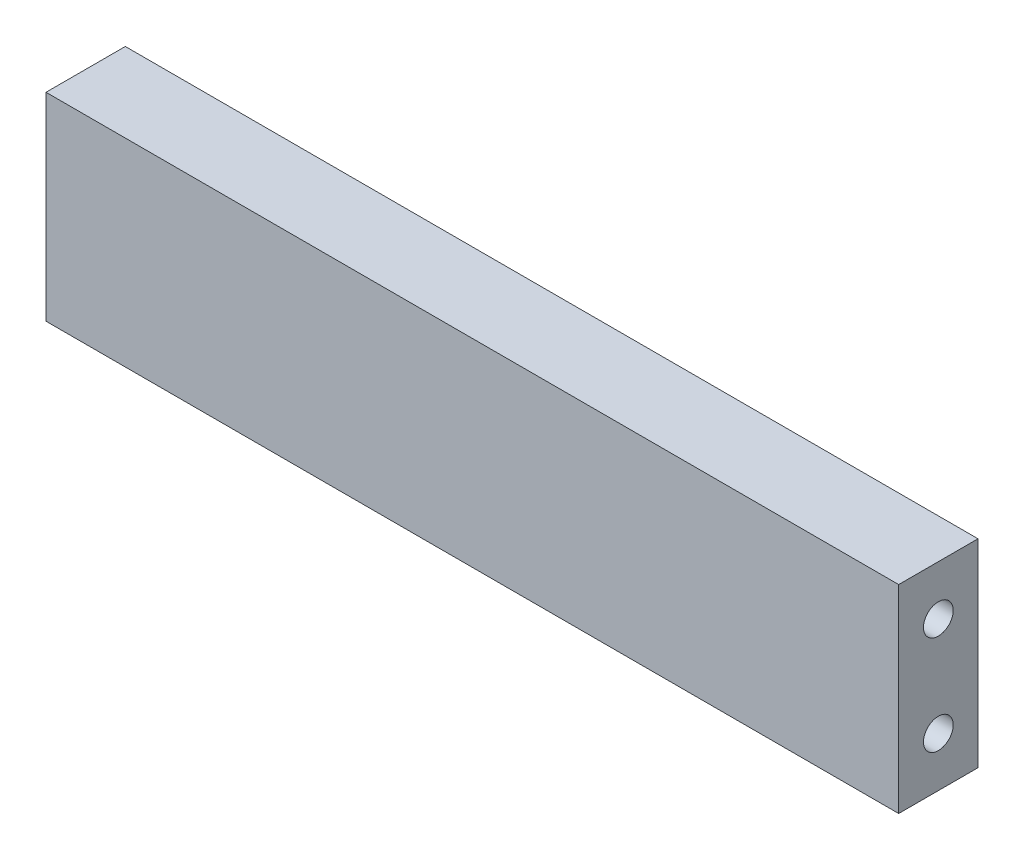
ISO-10303-21;
HEADER;
FILE_DESCRIPTION(('STEP AP214'),'2;1');
FILE_NAME('part.step','',(''),(''),'','','');
FILE_SCHEMA(('AUTOMOTIVE_DESIGN { 1 0 10303 214 1 1 1 1 }'));
ENDSEC;
DATA;
#1=APPLICATION_CONTEXT('core data for automotive mechanical design processes');
#2=APPLICATION_PROTOCOL_DEFINITION('international standard','automotive_design',2000,#1);
#3=PRODUCT_CONTEXT('',#1,'mechanical');
#4=PRODUCT('Part','Part','',(#3));
#5=PRODUCT_RELATED_PRODUCT_CATEGORY('part','',(#4));
#6=PRODUCT_DEFINITION_FORMATION('','',#4);
#7=PRODUCT_DEFINITION_CONTEXT('part definition',#1,'design');
#8=PRODUCT_DEFINITION('design','',#6,#7);
#9=PRODUCT_DEFINITION_SHAPE('','',#8);
#10=(LENGTH_UNIT() NAMED_UNIT(*) SI_UNIT(.MILLI.,.METRE.));
#11=(NAMED_UNIT(*) PLANE_ANGLE_UNIT() SI_UNIT($,.RADIAN.));
#12=(NAMED_UNIT(*) SI_UNIT($,.STERADIAN.) SOLID_ANGLE_UNIT());
#13=UNCERTAINTY_MEASURE_WITH_UNIT(LENGTH_MEASURE(1.E-05),#10,'distance_accuracy_value','');
#14=(GEOMETRIC_REPRESENTATION_CONTEXT(3) GLOBAL_UNCERTAINTY_ASSIGNED_CONTEXT((#13)) GLOBAL_UNIT_ASSIGNED_CONTEXT((#10,
#11,#12)) REPRESENTATION_CONTEXT('',''));
#15=CARTESIAN_POINT('',(0.,0.,0.));
#16=DIRECTION('',(0.,0.,1.));
#17=DIRECTION('',(1.,0.,0.));
#18=AXIS2_PLACEMENT_3D('',#15,#16,#17);
#19=CARTESIAN_POINT('',(-43.,10.,8.));
#20=DIRECTION('',(1.,0.,0.));
#21=DIRECTION('',(0.,0.,-1.));
#22=AXIS2_PLACEMENT_3D('',#19,#20,#21);
#23=PLANE('',#22);
#24=CARTESIAN_POINT('',(-43.,-5.00000000000003,4.));
#25=DIRECTION('',(-1.,0.,0.));
#26=DIRECTION('',(0.,0.,1.));
#27=AXIS2_PLACEMENT_3D('',#24,#25,#26);
#28=CIRCLE('',#27,1.5);
#29=CARTESIAN_POINT('',(-43.,-5.00000000000003,5.5));
#30=VERTEX_POINT('',#29);
#31=EDGE_CURVE('E111',#30,#30,#28,.T.);
#32=ORIENTED_EDGE('',*,*,#31,.F.);
#33=EDGE_LOOP('',(#32));
#34=FACE_BOUND('',#33,.T.);
#35=DIRECTION('',(0.,-1.,0.));
#36=VECTOR('',#35,1.);
#37=CARTESIAN_POINT('',(-43.,10.,0.));
#38=LINE('',#37,#36);
#39=CARTESIAN_POINT('',(-43.,10.,0.));
#40=VERTEX_POINT('',#39);
#41=CARTESIAN_POINT('',(-43.,-10.,0.));
#42=VERTEX_POINT('',#41);
#43=EDGE_CURVE('E116',#40,#42,#38,.T.);
#44=ORIENTED_EDGE('',*,*,#43,.T.);
#45=DIRECTION('',(0.,0.,-1.));
#46=VECTOR('',#45,1.);
#47=CARTESIAN_POINT('',(-43.,-10.,8.));
#48=LINE('',#47,#46);
#49=CARTESIAN_POINT('',(-43.,-10.,8.));
#50=VERTEX_POINT('',#49);
#51=EDGE_CURVE('E11',#50,#42,#48,.T.);
#52=ORIENTED_EDGE('',*,*,#51,.F.);
#53=DIRECTION('',(0.,-1.,0.));
#54=VECTOR('',#53,1.);
#55=CARTESIAN_POINT('',(-43.,10.,8.));
#56=LINE('',#55,#54);
#57=CARTESIAN_POINT('',(-43.,10.,8.));
#58=VERTEX_POINT('',#57);
#59=EDGE_CURVE('E175',#58,#50,#56,.T.);
#60=ORIENTED_EDGE('',*,*,#59,.F.);
#61=DIRECTION('',(0.,0.,-1.));
#62=VECTOR('',#61,1.);
#63=CARTESIAN_POINT('',(-43.,10.,8.));
#64=LINE('',#63,#62);
#65=EDGE_CURVE('E44',#58,#40,#64,.T.);
#66=ORIENTED_EDGE('',*,*,#65,.T.);
#67=EDGE_LOOP('',(#44,#52,#60,#66));
#68=FACE_BOUND('',#67,.T.);
#69=CARTESIAN_POINT('',(-43.,4.99999999999997,4.));
#70=DIRECTION('',(-1.,0.,0.));
#71=DIRECTION('',(0.,0.,1.));
#72=AXIS2_PLACEMENT_3D('',#69,#70,#71);
#73=CIRCLE('',#72,1.5);
#74=CARTESIAN_POINT('',(-43.,4.99999999999997,5.5));
#75=VERTEX_POINT('',#74);
#76=EDGE_CURVE('E120',#75,#75,#73,.T.);
#77=ORIENTED_EDGE('',*,*,#76,.F.);
#78=EDGE_LOOP('',(#77));
#79=FACE_BOUND('',#78,.T.);
#80=ADVANCED_FACE('F30',(#34,#68,#79),#23,.F.);
#81=CARTESIAN_POINT('',(43.,-10.,8.));
#82=DIRECTION('',(-1.,0.,0.));
#83=DIRECTION('',(0.,0.,1.));
#84=AXIS2_PLACEMENT_3D('',#81,#82,#83);
#85=PLANE('',#84);
#86=CARTESIAN_POINT('',(43.,-5.00000000000002,4.));
#87=DIRECTION('',(1.,0.,0.));
#88=DIRECTION('',(0.,0.,-1.));
#89=AXIS2_PLACEMENT_3D('',#86,#87,#88);
#90=CIRCLE('',#89,1.5);
#91=CARTESIAN_POINT('',(43.,-5.00000000000002,2.5));
#92=VERTEX_POINT('',#91);
#93=EDGE_CURVE('E154',#92,#92,#90,.T.);
#94=ORIENTED_EDGE('',*,*,#93,.F.);
#95=EDGE_LOOP('',(#94));
#96=FACE_BOUND('',#95,.T.);
#97=DIRECTION('',(0.,1.,0.));
#98=VECTOR('',#97,1.);
#99=CARTESIAN_POINT('',(43.,-10.,0.));
#100=LINE('',#99,#98);
#101=CARTESIAN_POINT('',(43.,-10.,0.));
#102=VERTEX_POINT('',#101);
#103=CARTESIAN_POINT('',(43.,10.,0.));
#104=VERTEX_POINT('',#103);
#105=EDGE_CURVE('E169',#102,#104,#100,.T.);
#106=ORIENTED_EDGE('',*,*,#105,.T.);
#107=DIRECTION('',(0.,0.,-1.));
#108=VECTOR('',#107,1.);
#109=CARTESIAN_POINT('',(43.,10.,8.));
#110=LINE('',#109,#108);
#111=CARTESIAN_POINT('',(43.,10.,8.));
#112=VERTEX_POINT('',#111);
#113=EDGE_CURVE('E184',#112,#104,#110,.T.);
#114=ORIENTED_EDGE('',*,*,#113,.F.);
#115=DIRECTION('',(0.,1.,0.));
#116=VECTOR('',#115,1.);
#117=CARTESIAN_POINT('',(43.,-10.,8.));
#118=LINE('',#117,#116);
#119=CARTESIAN_POINT('',(43.,-10.,8.));
#120=VERTEX_POINT('',#119);
#121=EDGE_CURVE('E52',#120,#112,#118,.T.);
#122=ORIENTED_EDGE('',*,*,#121,.F.);
#123=DIRECTION('',(0.,0.,-1.));
#124=VECTOR('',#123,1.);
#125=CARTESIAN_POINT('',(43.,-10.,8.));
#126=LINE('',#125,#124);
#127=EDGE_CURVE('E37',#120,#102,#126,.T.);
#128=ORIENTED_EDGE('',*,*,#127,.T.);
#129=EDGE_LOOP('',(#106,#114,#122,#128));
#130=FACE_BOUND('',#129,.T.);
#131=CARTESIAN_POINT('',(43.,4.99999999999998,4.));
#132=DIRECTION('',(1.,0.,0.));
#133=DIRECTION('',(0.,0.,-1.));
#134=AXIS2_PLACEMENT_3D('',#131,#132,#133);
#135=CIRCLE('',#134,1.5);
#136=CARTESIAN_POINT('',(43.,4.99999999999998,2.5));
#137=VERTEX_POINT('',#136);
#138=EDGE_CURVE('E132',#137,#137,#135,.T.);
#139=ORIENTED_EDGE('',*,*,#138,.F.);
#140=EDGE_LOOP('',(#139));
#141=FACE_BOUND('',#140,.T.);
#142=ADVANCED_FACE('F100',(#96,#130,#141),#85,.F.);
#143=CARTESIAN_POINT('',(43.,-10.,8.));
#144=DIRECTION('',(0.,-1.,0.));
#145=DIRECTION('',(1.,0.,0.));
#146=AXIS2_PLACEMENT_3D('',#143,#144,#145);
#147=PLANE('',#146);
#148=DIRECTION('',(-1.,0.,0.));
#149=VECTOR('',#148,1.);
#150=CARTESIAN_POINT('',(43.,-10.,0.));
#151=LINE('',#150,#149);
#152=EDGE_CURVE('E167',#102,#42,#151,.T.);
#153=ORIENTED_EDGE('',*,*,#152,.F.);
#154=ORIENTED_EDGE('',*,*,#127,.F.);
#155=DIRECTION('',(-1.,0.,0.));
#156=VECTOR('',#155,1.);
#157=CARTESIAN_POINT('',(43.,-10.,8.));
#158=LINE('',#157,#156);
#159=EDGE_CURVE('E177',#120,#50,#158,.T.);
#160=ORIENTED_EDGE('',*,*,#159,.T.);
#161=ORIENTED_EDGE('',*,*,#51,.T.);
#162=EDGE_LOOP('',(#153,#154,#160,#161));
#163=FACE_BOUND('',#162,.T.);
#164=ADVANCED_FACE('F105',(#163),#147,.T.);
#165=CARTESIAN_POINT('',(-43.,10.,8.));
#166=DIRECTION('',(0.,1.,0.));
#167=DIRECTION('',(-1.,0.,0.));
#168=AXIS2_PLACEMENT_3D('',#165,#166,#167);
#169=PLANE('',#168);
#170=DIRECTION('',(1.,0.,0.));
#171=VECTOR('',#170,1.);
#172=CARTESIAN_POINT('',(-43.,10.,0.));
#173=LINE('',#172,#171);
#174=EDGE_CURVE('E172',#40,#104,#173,.T.);
#175=ORIENTED_EDGE('',*,*,#174,.F.);
#176=ORIENTED_EDGE('',*,*,#65,.F.);
#177=DIRECTION('',(1.,0.,0.));
#178=VECTOR('',#177,1.);
#179=CARTESIAN_POINT('',(-43.,10.,8.));
#180=LINE('',#179,#178);
#181=EDGE_CURVE('E181',#58,#112,#180,.T.);
#182=ORIENTED_EDGE('',*,*,#181,.T.);
#183=ORIENTED_EDGE('',*,*,#113,.T.);
#184=EDGE_LOOP('',(#175,#176,#182,#183));
#185=FACE_BOUND('',#184,.T.);
#186=ADVANCED_FACE('F193',(#185),#169,.T.);
#187=CARTESIAN_POINT('',(-43.,10.,8.));
#188=DIRECTION('',(0.,0.,1.));
#189=DIRECTION('',(1.,0.,0.));
#190=AXIS2_PLACEMENT_3D('',#187,#188,#189);
#191=PLANE('',#190);
#192=ORIENTED_EDGE('',*,*,#59,.T.);
#193=ORIENTED_EDGE('',*,*,#159,.F.);
#194=ORIENTED_EDGE('',*,*,#121,.T.);
#195=ORIENTED_EDGE('',*,*,#181,.F.);
#196=EDGE_LOOP('',(#192,#193,#194,#195));
#197=FACE_BOUND('',#196,.T.);
#198=ADVANCED_FACE('F192',(#197),#191,.T.);
#199=CARTESIAN_POINT('',(-43.,10.,0.));
#200=DIRECTION('',(0.,0.,1.));
#201=DIRECTION('',(1.,0.,0.));
#202=AXIS2_PLACEMENT_3D('',#199,#200,#201);
#203=PLANE('',#202);
#204=ORIENTED_EDGE('',*,*,#43,.F.);
#205=ORIENTED_EDGE('',*,*,#174,.T.);
#206=ORIENTED_EDGE('',*,*,#105,.F.);
#207=ORIENTED_EDGE('',*,*,#152,.T.);
#208=EDGE_LOOP('',(#204,#205,#206,#207));
#209=FACE_BOUND('',#208,.T.);
#210=ADVANCED_FACE('F191',(#209),#203,.F.);
#211=CARTESIAN_POINT('',(31.5669872981078,-5.00000000000002,4.));
#212=DIRECTION('',(1.,0.,0.));
#213=DIRECTION('',(0.,0.,-1.));
#214=AXIS2_PLACEMENT_3D('',#211,#212,#213);
#215=CONICAL_SURFACE('',#214,0.,1.0471975511966);
#216=CARTESIAN_POINT('',(32.,-5.00000000000002,4.));
#217=DIRECTION('',(1.,0.,0.));
#218=DIRECTION('',(0.,0.,-1.));
#219=AXIS2_PLACEMENT_3D('',#216,#217,#218);
#220=CIRCLE('',#219,0.75);
#221=CARTESIAN_POINT('',(32.,-5.00000000000002,3.25));
#222=VERTEX_POINT('',#221);
#223=EDGE_CURVE('E163',#222,#222,#220,.T.);
#224=ORIENTED_EDGE('',*,*,#223,.T.);
#225=EDGE_LOOP('',(#224));
#226=FACE_BOUND('',#225,.T.);
#227=CARTESIAN_POINT('',(31.5669872981078,-5.00000000000002,4.));
#228=VERTEX_POINT('',#227);
#229=VERTEX_LOOP('',#228);
#230=FACE_BOUND('',#229,.T.);
#231=ADVANCED_FACE('F204',(#226,#230),#215,.F.);
#232=CARTESIAN_POINT('',(43.,-5.00000000000002,4.));
#233=DIRECTION('',(1.,0.,0.));
#234=DIRECTION('',(0.,0.,-1.));
#235=AXIS2_PLACEMENT_3D('',#232,#233,#234);
#236=CYLINDRICAL_SURFACE('',#235,0.75);
#237=CARTESIAN_POINT('',(35.,-5.00000000000002,4.));
#238=DIRECTION('',(1.,0.,0.));
#239=DIRECTION('',(0.,0.,-1.));
#240=AXIS2_PLACEMENT_3D('',#237,#238,#239);
#241=CIRCLE('',#240,0.75);
#242=CARTESIAN_POINT('',(35.,-5.00000000000002,3.25));
#243=VERTEX_POINT('',#242);
#244=EDGE_CURVE('E160',#243,#243,#241,.T.);
#245=ORIENTED_EDGE('',*,*,#244,.T.);
#246=EDGE_LOOP('',(#245));
#247=FACE_BOUND('',#246,.T.);
#248=ORIENTED_EDGE('',*,*,#223,.F.);
#249=EDGE_LOOP('',(#248));
#250=FACE_BOUND('',#249,.T.);
#251=ADVANCED_FACE('F207',(#247,#250),#236,.F.);
#252=CARTESIAN_POINT('',(35.,-4.25000000000003,4.));
#253=DIRECTION('',(1.,0.,0.));
#254=DIRECTION('',(0.,0.,-1.));
#255=AXIS2_PLACEMENT_3D('',#252,#253,#254);
#256=PLANE('',#255);
#257=CARTESIAN_POINT('',(35.,-5.00000000000002,4.));
#258=DIRECTION('',(1.,0.,0.));
#259=DIRECTION('',(0.,0.,-1.));
#260=AXIS2_PLACEMENT_3D('',#257,#258,#259);
#261=CIRCLE('',#260,1.5);
#262=CARTESIAN_POINT('',(35.,-5.00000000000002,2.5));
#263=VERTEX_POINT('',#262);
#264=EDGE_CURVE('E157',#263,#263,#261,.T.);
#265=ORIENTED_EDGE('',*,*,#264,.T.);
#266=EDGE_LOOP('',(#265));
#267=FACE_BOUND('',#266,.T.);
#268=ORIENTED_EDGE('',*,*,#244,.F.);
#269=EDGE_LOOP('',(#268));
#270=FACE_BOUND('',#269,.T.);
#271=ADVANCED_FACE('F211',(#267,#270),#256,.T.);
#272=CARTESIAN_POINT('',(43.,-5.00000000000002,4.));
#273=DIRECTION('',(1.,0.,0.));
#274=DIRECTION('',(0.,0.,-1.));
#275=AXIS2_PLACEMENT_3D('',#272,#273,#274);
#276=CYLINDRICAL_SURFACE('',#275,1.5);
#277=ORIENTED_EDGE('',*,*,#93,.T.);
#278=EDGE_LOOP('',(#277));
#279=FACE_BOUND('',#278,.T.);
#280=ORIENTED_EDGE('',*,*,#264,.F.);
#281=EDGE_LOOP('',(#280));
#282=FACE_BOUND('',#281,.T.);
#283=ADVANCED_FACE('F215',(#279,#282),#276,.F.);
#284=CARTESIAN_POINT('',(-31.5669872981078,-5.00000000000003,4.));
#285=DIRECTION('',(-1.,0.,0.));
#286=DIRECTION('',(0.,0.,1.));
#287=AXIS2_PLACEMENT_3D('',#284,#285,#286);
#288=CONICAL_SURFACE('',#287,0.,1.0471975511966);
#289=CARTESIAN_POINT('',(-32.,-5.00000000000003,4.));
#290=DIRECTION('',(-1.,0.,0.));
#291=DIRECTION('',(0.,0.,1.));
#292=AXIS2_PLACEMENT_3D('',#289,#290,#291);
#293=CIRCLE('',#292,0.75);
#294=CARTESIAN_POINT('',(-32.,-5.00000000000003,4.75));
#295=VERTEX_POINT('',#294);
#296=EDGE_CURVE('E151',#295,#295,#293,.T.);
#297=ORIENTED_EDGE('',*,*,#296,.T.);
#298=EDGE_LOOP('',(#297));
#299=FACE_BOUND('',#298,.T.);
#300=CARTESIAN_POINT('',(-31.5669872981078,-5.00000000000003,4.));
#301=VERTEX_POINT('',#300);
#302=VERTEX_LOOP('',#301);
#303=FACE_BOUND('',#302,.T.);
#304=ADVANCED_FACE('F219',(#299,#303),#288,.F.);
#305=CARTESIAN_POINT('',(-43.,-5.00000000000003,4.));
#306=DIRECTION('',(-1.,0.,0.));
#307=DIRECTION('',(0.,0.,1.));
#308=AXIS2_PLACEMENT_3D('',#305,#306,#307);
#309=CYLINDRICAL_SURFACE('',#308,0.75);
#310=CARTESIAN_POINT('',(-35.,-5.00000000000003,4.));
#311=DIRECTION('',(-1.,0.,0.));
#312=DIRECTION('',(0.,0.,1.));
#313=AXIS2_PLACEMENT_3D('',#310,#311,#312);
#314=CIRCLE('',#313,0.75);
#315=CARTESIAN_POINT('',(-35.,-5.00000000000003,4.75));
#316=VERTEX_POINT('',#315);
#317=EDGE_CURVE('E148',#316,#316,#314,.T.);
#318=ORIENTED_EDGE('',*,*,#317,.T.);
#319=EDGE_LOOP('',(#318));
#320=FACE_BOUND('',#319,.T.);
#321=ORIENTED_EDGE('',*,*,#296,.F.);
#322=EDGE_LOOP('',(#321));
#323=FACE_BOUND('',#322,.T.);
#324=ADVANCED_FACE('F223',(#320,#323),#309,.F.);
#325=CARTESIAN_POINT('',(-35.,-4.25000000000003,4.));
#326=DIRECTION('',(-1.,0.,0.));
#327=DIRECTION('',(0.,0.,1.));
#328=AXIS2_PLACEMENT_3D('',#325,#326,#327);
#329=PLANE('',#328);
#330=CARTESIAN_POINT('',(-35.,-5.00000000000003,4.));
#331=DIRECTION('',(-1.,0.,0.));
#332=DIRECTION('',(0.,0.,1.));
#333=AXIS2_PLACEMENT_3D('',#330,#331,#332);
#334=CIRCLE('',#333,1.5);
#335=CARTESIAN_POINT('',(-35.,-5.00000000000003,5.5));
#336=VERTEX_POINT('',#335);
#337=EDGE_CURVE('E145',#336,#336,#334,.T.);
#338=ORIENTED_EDGE('',*,*,#337,.T.);
#339=EDGE_LOOP('',(#338));
#340=FACE_BOUND('',#339,.T.);
#341=ORIENTED_EDGE('',*,*,#317,.F.);
#342=EDGE_LOOP('',(#341));
#343=FACE_BOUND('',#342,.T.);
#344=ADVANCED_FACE('F227',(#340,#343),#329,.T.);
#345=CARTESIAN_POINT('',(-43.,-5.00000000000003,4.));
#346=DIRECTION('',(-1.,0.,0.));
#347=DIRECTION('',(0.,0.,1.));
#348=AXIS2_PLACEMENT_3D('',#345,#346,#347);
#349=CYLINDRICAL_SURFACE('',#348,1.5);
#350=ORIENTED_EDGE('',*,*,#31,.T.);
#351=EDGE_LOOP('',(#350));
#352=FACE_BOUND('',#351,.T.);
#353=ORIENTED_EDGE('',*,*,#337,.F.);
#354=EDGE_LOOP('',(#353));
#355=FACE_BOUND('',#354,.T.);
#356=ADVANCED_FACE('F231',(#352,#355),#349,.F.);
#357=CARTESIAN_POINT('',(31.5669872981078,4.99999999999998,4.));
#358=DIRECTION('',(1.,0.,0.));
#359=DIRECTION('',(0.,0.,-1.));
#360=AXIS2_PLACEMENT_3D('',#357,#358,#359);
#361=CONICAL_SURFACE('',#360,0.,1.0471975511966);
#362=CARTESIAN_POINT('',(32.,4.99999999999998,4.));
#363=DIRECTION('',(1.,0.,0.));
#364=DIRECTION('',(0.,0.,-1.));
#365=AXIS2_PLACEMENT_3D('',#362,#363,#364);
#366=CIRCLE('',#365,0.75);
#367=CARTESIAN_POINT('',(32.,4.99999999999998,3.25));
#368=VERTEX_POINT('',#367);
#369=EDGE_CURVE('E141',#368,#368,#366,.T.);
#370=ORIENTED_EDGE('',*,*,#369,.T.);
#371=EDGE_LOOP('',(#370));
#372=FACE_BOUND('',#371,.T.);
#373=CARTESIAN_POINT('',(31.5669872981078,4.99999999999998,4.));
#374=VERTEX_POINT('',#373);
#375=VERTEX_LOOP('',#374);
#376=FACE_BOUND('',#375,.T.);
#377=ADVANCED_FACE('F235',(#372,#376),#361,.F.);
#378=CARTESIAN_POINT('',(43.,4.99999999999998,4.));
#379=DIRECTION('',(1.,0.,0.));
#380=DIRECTION('',(0.,0.,-1.));
#381=AXIS2_PLACEMENT_3D('',#378,#379,#380);
#382=CYLINDRICAL_SURFACE('',#381,0.75);
#383=CARTESIAN_POINT('',(35.,4.99999999999998,4.));
#384=DIRECTION('',(1.,0.,0.));
#385=DIRECTION('',(0.,0.,-1.));
#386=AXIS2_PLACEMENT_3D('',#383,#384,#385);
#387=CIRCLE('',#386,0.75);
#388=CARTESIAN_POINT('',(35.,4.99999999999998,3.25));
#389=VERTEX_POINT('',#388);
#390=EDGE_CURVE('E138',#389,#389,#387,.T.);
#391=ORIENTED_EDGE('',*,*,#390,.T.);
#392=EDGE_LOOP('',(#391));
#393=FACE_BOUND('',#392,.T.);
#394=ORIENTED_EDGE('',*,*,#369,.F.);
#395=EDGE_LOOP('',(#394));
#396=FACE_BOUND('',#395,.T.);
#397=ADVANCED_FACE('F239',(#393,#396),#382,.F.);
#398=CARTESIAN_POINT('',(35.,5.74999999999998,4.));
#399=DIRECTION('',(1.,0.,0.));
#400=DIRECTION('',(0.,0.,-1.));
#401=AXIS2_PLACEMENT_3D('',#398,#399,#400);
#402=PLANE('',#401);
#403=CARTESIAN_POINT('',(35.,4.99999999999998,4.));
#404=DIRECTION('',(1.,0.,0.));
#405=DIRECTION('',(0.,0.,-1.));
#406=AXIS2_PLACEMENT_3D('',#403,#404,#405);
#407=CIRCLE('',#406,1.5);
#408=CARTESIAN_POINT('',(35.,4.99999999999998,2.5));
#409=VERTEX_POINT('',#408);
#410=EDGE_CURVE('E135',#409,#409,#407,.T.);
#411=ORIENTED_EDGE('',*,*,#410,.T.);
#412=EDGE_LOOP('',(#411));
#413=FACE_BOUND('',#412,.T.);
#414=ORIENTED_EDGE('',*,*,#390,.F.);
#415=EDGE_LOOP('',(#414));
#416=FACE_BOUND('',#415,.T.);
#417=ADVANCED_FACE('F95',(#413,#416),#402,.T.);
#418=CARTESIAN_POINT('',(43.,4.99999999999998,4.));
#419=DIRECTION('',(1.,0.,0.));
#420=DIRECTION('',(0.,0.,-1.));
#421=AXIS2_PLACEMENT_3D('',#418,#419,#420);
#422=CYLINDRICAL_SURFACE('',#421,1.5);
#423=ORIENTED_EDGE('',*,*,#138,.T.);
#424=EDGE_LOOP('',(#423));
#425=FACE_BOUND('',#424,.T.);
#426=ORIENTED_EDGE('',*,*,#410,.F.);
#427=EDGE_LOOP('',(#426));
#428=FACE_BOUND('',#427,.T.);
#429=ADVANCED_FACE('F85',(#425,#428),#422,.F.);
#430=CARTESIAN_POINT('',(-31.5669872981078,4.99999999999997,4.));
#431=DIRECTION('',(-1.,0.,0.));
#432=DIRECTION('',(0.,0.,1.));
#433=AXIS2_PLACEMENT_3D('',#430,#431,#432);
#434=CONICAL_SURFACE('',#433,0.,1.0471975511966);
#435=CARTESIAN_POINT('',(-32.,4.99999999999997,4.));
#436=DIRECTION('',(-1.,0.,0.));
#437=DIRECTION('',(0.,0.,1.));
#438=AXIS2_PLACEMENT_3D('',#435,#436,#437);
#439=CIRCLE('',#438,0.75);
#440=CARTESIAN_POINT('',(-32.,4.99999999999997,4.75));
#441=VERTEX_POINT('',#440);
#442=EDGE_CURVE('E130',#441,#441,#439,.T.);
#443=ORIENTED_EDGE('',*,*,#442,.T.);
#444=EDGE_LOOP('',(#443));
#445=FACE_BOUND('',#444,.T.);
#446=CARTESIAN_POINT('',(-31.5669872981078,4.99999999999997,4.));
#447=VERTEX_POINT('',#446);
#448=VERTEX_LOOP('',#447);
#449=FACE_BOUND('',#448,.T.);
#450=ADVANCED_FACE('F82',(#445,#449),#434,.F.);
#451=CARTESIAN_POINT('',(-43.,4.99999999999997,4.));
#452=DIRECTION('',(-1.,0.,0.));
#453=DIRECTION('',(0.,0.,1.));
#454=AXIS2_PLACEMENT_3D('',#451,#452,#453);
#455=CYLINDRICAL_SURFACE('',#454,0.75);
#456=CARTESIAN_POINT('',(-35.,4.99999999999997,4.));
#457=DIRECTION('',(-1.,0.,0.));
#458=DIRECTION('',(0.,0.,1.));
#459=AXIS2_PLACEMENT_3D('',#456,#457,#458);
#460=CIRCLE('',#459,0.75);
#461=CARTESIAN_POINT('',(-35.,4.99999999999997,4.75));
#462=VERTEX_POINT('',#461);
#463=EDGE_CURVE('E125',#462,#462,#460,.T.);
#464=ORIENTED_EDGE('',*,*,#463,.T.);
#465=EDGE_LOOP('',(#464));
#466=FACE_BOUND('',#465,.T.);
#467=ORIENTED_EDGE('',*,*,#442,.F.);
#468=EDGE_LOOP('',(#467));
#469=FACE_BOUND('',#468,.T.);
#470=ADVANCED_FACE('F84',(#466,#469),#455,.F.);
#471=CARTESIAN_POINT('',(-35.,5.74999999999997,4.));
#472=DIRECTION('',(-1.,0.,0.));
#473=DIRECTION('',(0.,0.,1.));
#474=AXIS2_PLACEMENT_3D('',#471,#472,#473);
#475=PLANE('',#474);
#476=CARTESIAN_POINT('',(-35.,4.99999999999997,4.));
#477=DIRECTION('',(-1.,0.,0.));
#478=DIRECTION('',(0.,0.,1.));
#479=AXIS2_PLACEMENT_3D('',#476,#477,#478);
#480=CIRCLE('',#479,1.5);
#481=CARTESIAN_POINT('',(-35.,4.99999999999997,5.5));
#482=VERTEX_POINT('',#481);
#483=EDGE_CURVE('E122',#482,#482,#480,.T.);
#484=ORIENTED_EDGE('',*,*,#483,.T.);
#485=EDGE_LOOP('',(#484));
#486=FACE_BOUND('',#485,.T.);
#487=ORIENTED_EDGE('',*,*,#463,.F.);
#488=EDGE_LOOP('',(#487));
#489=FACE_BOUND('',#488,.T.);
#490=ADVANCED_FACE('F92',(#486,#489),#475,.T.);
#491=CARTESIAN_POINT('',(-43.,4.99999999999997,4.));
#492=DIRECTION('',(-1.,0.,0.));
#493=DIRECTION('',(0.,0.,1.));
#494=AXIS2_PLACEMENT_3D('',#491,#492,#493);
#495=CYLINDRICAL_SURFACE('',#494,1.5);
#496=ORIENTED_EDGE('',*,*,#76,.T.);
#497=EDGE_LOOP('',(#496));
#498=FACE_BOUND('',#497,.T.);
#499=ORIENTED_EDGE('',*,*,#483,.F.);
#500=EDGE_LOOP('',(#499));
#501=FACE_BOUND('',#500,.T.);
#502=ADVANCED_FACE('F281',(#498,#501),#495,.F.);
#503=CLOSED_SHELL('',(#80,#142,#164,#186,#198,#210,#231,#251,#271,#283,#304,#324,#344,#356,#377,
#397,#417,#429,#450,#470,#490,#502));
#504=MANIFOLD_SOLID_BREP('B2',#503);
#505=ADVANCED_BREP_SHAPE_REPRESENTATION('',(#18,#504),#14);
#506=SHAPE_DEFINITION_REPRESENTATION(#9,#505);
ENDSEC;
END-ISO-10303-21;
